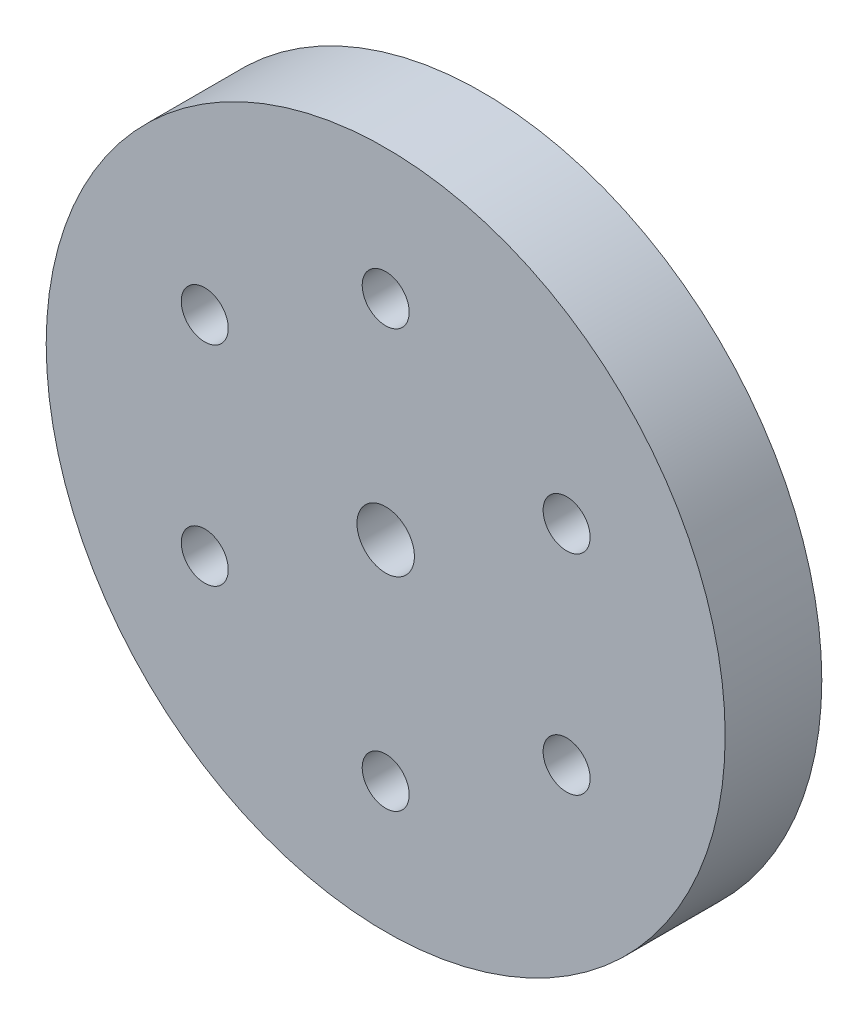
ISO-10303-21;
HEADER;
FILE_DESCRIPTION(('STEP AP214'),'2;1');
FILE_NAME('part.step','',(''),(''),'','','');
FILE_SCHEMA(('AUTOMOTIVE_DESIGN { 1 0 10303 214 1 1 1 1 }'));
ENDSEC;
DATA;
#1=APPLICATION_CONTEXT('core data for automotive mechanical design processes');
#2=APPLICATION_PROTOCOL_DEFINITION('international standard','automotive_design',2000,#1);
#3=PRODUCT_CONTEXT('',#1,'mechanical');
#4=PRODUCT('Part','Part','',(#3));
#5=PRODUCT_RELATED_PRODUCT_CATEGORY('part','',(#4));
#6=PRODUCT_DEFINITION_FORMATION('','',#4);
#7=PRODUCT_DEFINITION_CONTEXT('part definition',#1,'design');
#8=PRODUCT_DEFINITION('design','',#6,#7);
#9=PRODUCT_DEFINITION_SHAPE('','',#8);
#10=(LENGTH_UNIT() NAMED_UNIT(*) SI_UNIT(.MILLI.,.METRE.));
#11=(NAMED_UNIT(*) PLANE_ANGLE_UNIT() SI_UNIT($,.RADIAN.));
#12=(NAMED_UNIT(*) SI_UNIT($,.STERADIAN.) SOLID_ANGLE_UNIT());
#13=UNCERTAINTY_MEASURE_WITH_UNIT(LENGTH_MEASURE(1.E-05),#10,'distance_accuracy_value','');
#14=(GEOMETRIC_REPRESENTATION_CONTEXT(3) GLOBAL_UNCERTAINTY_ASSIGNED_CONTEXT((#13)) GLOBAL_UNIT_ASSIGNED_CONTEXT((#10,
#11,#12)) REPRESENTATION_CONTEXT('',''));
#15=CARTESIAN_POINT('',(0.,0.,0.));
#16=DIRECTION('',(0.,0.,1.));
#17=DIRECTION('',(1.,0.,0.));
#18=AXIS2_PLACEMENT_3D('',#15,#16,#17);
#19=CARTESIAN_POINT('',(-6.92820323027552,3.99999999999998,3.7));
#20=DIRECTION('',(0.,0.,-1.));
#21=DIRECTION('',(-1.,0.,0.));
#22=AXIS2_PLACEMENT_3D('',#19,#20,#21);
#23=CYLINDRICAL_SURFACE('',#22,0.9);
#24=CARTESIAN_POINT('',(-6.92820323027552,3.99999999999998,3.7));
#25=DIRECTION('',(0.,0.,-1.));
#26=DIRECTION('',(-0.499999999999998,-0.86602540378444,0.));
#27=AXIS2_PLACEMENT_3D('',#24,#25,#26);
#28=CIRCLE('',#27,0.9);
#29=CARTESIAN_POINT('',(-7.37820323027552,3.22057713659399,3.7));
#30=VERTEX_POINT('',#29);
#31=EDGE_CURVE('E86',#30,#30,#28,.T.);
#32=ORIENTED_EDGE('',*,*,#31,.F.);
#33=EDGE_LOOP('',(#32));
#34=FACE_BOUND('',#33,.T.);
#35=CARTESIAN_POINT('',(-6.92820323027552,3.99999999999998,1.5));
#36=DIRECTION('',(0.,0.,-1.));
#37=DIRECTION('',(-1.,0.,0.));
#38=AXIS2_PLACEMENT_3D('',#35,#36,#37);
#39=CIRCLE('',#38,0.9);
#40=CARTESIAN_POINT('',(-7.82820323027552,3.99999999999998,1.5));
#41=VERTEX_POINT('',#40);
#42=EDGE_CURVE('E41',#41,#41,#39,.F.);
#43=ORIENTED_EDGE('',*,*,#42,.F.);
#44=EDGE_LOOP('',(#43));
#45=FACE_BOUND('',#44,.T.);
#46=ADVANCED_FACE('F37',(#34,#45),#23,.F.);
#47=CARTESIAN_POINT('',(-6.92820323027549,-4.00000000000003,3.7));
#48=DIRECTION('',(0.,0.,-1.));
#49=DIRECTION('',(-1.,0.,0.));
#50=AXIS2_PLACEMENT_3D('',#47,#48,#49);
#51=CYLINDRICAL_SURFACE('',#50,0.9);
#52=CARTESIAN_POINT('',(-6.92820323027549,-4.00000000000003,3.7));
#53=DIRECTION('',(0.,0.,-1.));
#54=DIRECTION('',(0.500000000000004,-0.866025403784436,0.));
#55=AXIS2_PLACEMENT_3D('',#52,#53,#54);
#56=CIRCLE('',#55,0.9);
#57=CARTESIAN_POINT('',(-6.47820323027549,-4.77942286340603,3.7));
#58=VERTEX_POINT('',#57);
#59=EDGE_CURVE('E90',#58,#58,#56,.T.);
#60=ORIENTED_EDGE('',*,*,#59,.F.);
#61=EDGE_LOOP('',(#60));
#62=FACE_BOUND('',#61,.T.);
#63=CARTESIAN_POINT('',(-6.92820323027549,-4.00000000000003,1.5));
#64=DIRECTION('',(0.,0.,-1.));
#65=DIRECTION('',(-1.,0.,0.));
#66=AXIS2_PLACEMENT_3D('',#63,#64,#65);
#67=CIRCLE('',#66,0.9);
#68=CARTESIAN_POINT('',(-7.82820323027549,-4.00000000000003,1.5));
#69=VERTEX_POINT('',#68);
#70=EDGE_CURVE('E68',#69,#69,#67,.F.);
#71=ORIENTED_EDGE('',*,*,#70,.F.);
#72=EDGE_LOOP('',(#71));
#73=FACE_BOUND('',#72,.T.);
#74=ADVANCED_FACE('F119',(#62,#73),#51,.F.);
#75=CARTESIAN_POINT('',(0.,-8.,3.7));
#76=DIRECTION('',(0.,0.,-1.));
#77=DIRECTION('',(-1.,0.,0.));
#78=AXIS2_PLACEMENT_3D('',#75,#76,#77);
#79=CYLINDRICAL_SURFACE('',#78,0.9);
#80=CARTESIAN_POINT('',(0.,-8.,3.7));
#81=DIRECTION('',(0.,0.,-1.));
#82=DIRECTION('',(1.,0.,0.));
#83=AXIS2_PLACEMENT_3D('',#80,#81,#82);
#84=CIRCLE('',#83,0.9);
#85=CARTESIAN_POINT('',(0.9,-8.,3.7));
#86=VERTEX_POINT('',#85);
#87=EDGE_CURVE('E82',#86,#86,#84,.T.);
#88=ORIENTED_EDGE('',*,*,#87,.F.);
#89=EDGE_LOOP('',(#88));
#90=FACE_BOUND('',#89,.T.);
#91=CARTESIAN_POINT('',(0.,-8.,1.5));
#92=DIRECTION('',(0.,0.,-1.));
#93=DIRECTION('',(-1.,0.,0.));
#94=AXIS2_PLACEMENT_3D('',#91,#92,#93);
#95=CIRCLE('',#94,0.9);
#96=CARTESIAN_POINT('',(-0.9,-8.,1.5));
#97=VERTEX_POINT('',#96);
#98=EDGE_CURVE('E66',#97,#97,#95,.F.);
#99=ORIENTED_EDGE('',*,*,#98,.F.);
#100=EDGE_LOOP('',(#99));
#101=FACE_BOUND('',#100,.T.);
#102=ADVANCED_FACE('F125',(#90,#101),#79,.F.);
#103=CARTESIAN_POINT('',(6.92820323027555,-3.99999999999994,3.7));
#104=DIRECTION('',(0.,0.,-1.));
#105=DIRECTION('',(-1.,0.,0.));
#106=AXIS2_PLACEMENT_3D('',#103,#104,#105);
#107=CYLINDRICAL_SURFACE('',#106,0.9);
#108=CARTESIAN_POINT('',(6.92820323027555,-3.99999999999994,3.7));
#109=DIRECTION('',(0.,0.,-1.));
#110=DIRECTION('',(0.499999999999992,0.866025403784443,0.));
#111=AXIS2_PLACEMENT_3D('',#108,#109,#110);
#112=CIRCLE('',#111,0.9);
#113=CARTESIAN_POINT('',(7.37820323027554,-3.22057713659394,3.7));
#114=VERTEX_POINT('',#113);
#115=EDGE_CURVE('E77',#114,#114,#112,.T.);
#116=ORIENTED_EDGE('',*,*,#115,.F.);
#117=EDGE_LOOP('',(#116));
#118=FACE_BOUND('',#117,.T.);
#119=CARTESIAN_POINT('',(6.92820323027555,-3.99999999999994,1.5));
#120=DIRECTION('',(0.,0.,-1.));
#121=DIRECTION('',(-1.,0.,0.));
#122=AXIS2_PLACEMENT_3D('',#119,#120,#121);
#123=CIRCLE('',#122,0.9);
#124=CARTESIAN_POINT('',(6.02820323027555,-3.99999999999994,1.5));
#125=VERTEX_POINT('',#124);
#126=EDGE_CURVE('E62',#125,#125,#123,.F.);
#127=ORIENTED_EDGE('',*,*,#126,.F.);
#128=EDGE_LOOP('',(#127));
#129=FACE_BOUND('',#128,.T.);
#130=ADVANCED_FACE('F172',(#118,#129),#107,.F.);
#131=CARTESIAN_POINT('',(6.92820323027546,4.00000000000008,3.7));
#132=DIRECTION('',(0.,0.,-1.));
#133=DIRECTION('',(-1.,0.,0.));
#134=AXIS2_PLACEMENT_3D('',#131,#132,#133);
#135=CYLINDRICAL_SURFACE('',#134,0.9);
#136=CARTESIAN_POINT('',(6.92820323027546,4.00000000000008,3.7));
#137=DIRECTION('',(0.,0.,-1.));
#138=DIRECTION('',(-0.50000000000001,0.866025403784433,0.));
#139=AXIS2_PLACEMENT_3D('',#136,#137,#138);
#140=CIRCLE('',#139,0.9);
#141=CARTESIAN_POINT('',(6.47820323027545,4.77942286340607,3.7));
#142=VERTEX_POINT('',#141);
#143=EDGE_CURVE('E73',#142,#142,#140,.T.);
#144=ORIENTED_EDGE('',*,*,#143,.F.);
#145=EDGE_LOOP('',(#144));
#146=FACE_BOUND('',#145,.T.);
#147=CARTESIAN_POINT('',(6.92820323027546,4.00000000000008,1.5));
#148=DIRECTION('',(0.,0.,-1.));
#149=DIRECTION('',(-1.,0.,0.));
#150=AXIS2_PLACEMENT_3D('',#147,#148,#149);
#151=CIRCLE('',#150,0.9);
#152=CARTESIAN_POINT('',(6.02820323027546,4.00000000000008,1.5));
#153=VERTEX_POINT('',#152);
#154=EDGE_CURVE('E59',#153,#153,#151,.F.);
#155=ORIENTED_EDGE('',*,*,#154,.F.);
#156=EDGE_LOOP('',(#155));
#157=FACE_BOUND('',#156,.T.);
#158=ADVANCED_FACE('F115',(#146,#157),#135,.F.);
#159=CARTESIAN_POINT('',(0.,8.,3.7));
#160=DIRECTION('',(0.,0.,-1.));
#161=DIRECTION('',(-1.,0.,0.));
#162=AXIS2_PLACEMENT_3D('',#159,#160,#161);
#163=CYLINDRICAL_SURFACE('',#162,0.9);
#164=CARTESIAN_POINT('',(0.,8.,3.7));
#165=DIRECTION('',(0.,0.,-1.));
#166=DIRECTION('',(-1.,0.,0.));
#167=AXIS2_PLACEMENT_3D('',#164,#165,#166);
#168=CIRCLE('',#167,0.9);
#169=CARTESIAN_POINT('',(-0.9,8.,3.7));
#170=VERTEX_POINT('',#169);
#171=EDGE_CURVE('E50',#170,#170,#168,.T.);
#172=ORIENTED_EDGE('',*,*,#171,.F.);
#173=EDGE_LOOP('',(#172));
#174=FACE_BOUND('',#173,.T.);
#175=CARTESIAN_POINT('',(0.,8.,1.5));
#176=DIRECTION('',(0.,0.,-1.));
#177=DIRECTION('',(-1.,0.,0.));
#178=AXIS2_PLACEMENT_3D('',#175,#176,#177);
#179=CIRCLE('',#178,0.9);
#180=CARTESIAN_POINT('',(-0.9,8.,1.5));
#181=VERTEX_POINT('',#180);
#182=EDGE_CURVE('E55',#181,#181,#179,.F.);
#183=ORIENTED_EDGE('',*,*,#182,.F.);
#184=EDGE_LOOP('',(#183));
#185=FACE_BOUND('',#184,.T.);
#186=ADVANCED_FACE('F106',(#174,#185),#163,.F.);
#187=CARTESIAN_POINT('',(0.,0.,3.7));
#188=DIRECTION('',(0.,0.,-1.));
#189=DIRECTION('',(-1.,0.,0.));
#190=AXIS2_PLACEMENT_3D('',#187,#188,#189);
#191=CYLINDRICAL_SURFACE('',#190,13.);
#192=CARTESIAN_POINT('',(0.,0.,3.7));
#193=DIRECTION('',(0.,0.,1.));
#194=DIRECTION('',(1.,0.,0.));
#195=AXIS2_PLACEMENT_3D('',#192,#193,#194);
#196=CIRCLE('',#195,13.);
#197=CARTESIAN_POINT('',(13.,0.,3.7));
#198=VERTEX_POINT('',#197);
#199=EDGE_CURVE('E10',#198,#198,#196,.T.);
#200=ORIENTED_EDGE('',*,*,#199,.F.);
#201=EDGE_LOOP('',(#200));
#202=FACE_BOUND('',#201,.T.);
#203=CARTESIAN_POINT('',(0.,0.,0.));
#204=DIRECTION('',(0.,0.,1.));
#205=DIRECTION('',(1.,0.,0.));
#206=AXIS2_PLACEMENT_3D('',#203,#204,#205);
#207=CIRCLE('',#206,13.);
#208=CARTESIAN_POINT('',(13.,0.,0.));
#209=VERTEX_POINT('',#208);
#210=EDGE_CURVE('E45',#209,#209,#207,.T.);
#211=ORIENTED_EDGE('',*,*,#210,.T.);
#212=EDGE_LOOP('',(#211));
#213=FACE_BOUND('',#212,.T.);
#214=ADVANCED_FACE('F39',(#202,#213),#191,.T.);
#215=CARTESIAN_POINT('',(0.,0.,3.7));
#216=DIRECTION('',(0.,0.,1.));
#217=DIRECTION('',(1.,0.,0.));
#218=AXIS2_PLACEMENT_3D('',#215,#216,#217);
#219=PLANE('',#218);
#220=CARTESIAN_POINT('',(0.,0.,3.7));
#221=DIRECTION('',(0.,0.,-1.));
#222=DIRECTION('',(-1.,0.,0.));
#223=AXIS2_PLACEMENT_3D('',#220,#221,#222);
#224=CIRCLE('',#223,1.1);
#225=CARTESIAN_POINT('',(-1.1,0.,3.7));
#226=VERTEX_POINT('',#225);
#227=EDGE_CURVE('E214',#226,#226,#224,.T.);
#228=ORIENTED_EDGE('',*,*,#227,.T.);
#229=EDGE_LOOP('',(#228));
#230=FACE_BOUND('',#229,.T.);
#231=ORIENTED_EDGE('',*,*,#143,.T.);
#232=EDGE_LOOP('',(#231));
#233=FACE_BOUND('',#232,.T.);
#234=ORIENTED_EDGE('',*,*,#115,.T.);
#235=EDGE_LOOP('',(#234));
#236=FACE_BOUND('',#235,.T.);
#237=ORIENTED_EDGE('',*,*,#87,.T.);
#238=EDGE_LOOP('',(#237));
#239=FACE_BOUND('',#238,.T.);
#240=ORIENTED_EDGE('',*,*,#59,.T.);
#241=EDGE_LOOP('',(#240));
#242=FACE_BOUND('',#241,.T.);
#243=ORIENTED_EDGE('',*,*,#31,.T.);
#244=EDGE_LOOP('',(#243));
#245=FACE_BOUND('',#244,.T.);
#246=ORIENTED_EDGE('',*,*,#171,.T.);
#247=EDGE_LOOP('',(#246));
#248=FACE_BOUND('',#247,.T.);
#249=ORIENTED_EDGE('',*,*,#199,.T.);
#250=EDGE_LOOP('',(#249));
#251=FACE_BOUND('',#250,.T.);
#252=ADVANCED_FACE('F101',(#230,#233,#236,#239,#242,#245,#248,#251),#219,.T.);
#253=CARTESIAN_POINT('',(0.,0.,0.));
#254=DIRECTION('',(0.,0.,1.));
#255=DIRECTION('',(1.,0.,0.));
#256=AXIS2_PLACEMENT_3D('',#253,#254,#255);
#257=PLANE('',#256);
#258=CARTESIAN_POINT('',(0.,0.,0.));
#259=DIRECTION('',(0.,0.,-1.));
#260=DIRECTION('',(-1.,0.,0.));
#261=AXIS2_PLACEMENT_3D('',#258,#259,#260);
#262=CIRCLE('',#261,1.1);
#263=CARTESIAN_POINT('',(-1.1,0.,0.));
#264=VERTEX_POINT('',#263);
#265=EDGE_CURVE('E217',#264,#264,#262,.T.);
#266=ORIENTED_EDGE('',*,*,#265,.F.);
#267=EDGE_LOOP('',(#266));
#268=FACE_BOUND('',#267,.T.);
#269=CARTESIAN_POINT('',(6.92820323027546,4.00000000000008,0.));
#270=DIRECTION('',(0.,0.,-1.));
#271=DIRECTION('',(-0.50000000000001,0.866025403784433,0.));
#272=AXIS2_PLACEMENT_3D('',#269,#270,#271);
#273=CIRCLE('',#272,1.5);
#274=CARTESIAN_POINT('',(6.17820323027545,5.29903810567673,0.));
#275=VERTEX_POINT('',#274);
#276=EDGE_CURVE('E219',#275,#275,#273,.T.);
#277=ORIENTED_EDGE('',*,*,#276,.F.);
#278=EDGE_LOOP('',(#277));
#279=FACE_BOUND('',#278,.T.);
#280=CARTESIAN_POINT('',(6.92820323027555,-3.99999999999994,0.));
#281=DIRECTION('',(0.,0.,-1.));
#282=DIRECTION('',(0.499999999999992,0.866025403784443,0.));
#283=AXIS2_PLACEMENT_3D('',#280,#281,#282);
#284=CIRCLE('',#283,1.5);
#285=CARTESIAN_POINT('',(7.67820323027553,-2.70096189432327,0.));
#286=VERTEX_POINT('',#285);
#287=EDGE_CURVE('E237',#286,#286,#284,.T.);
#288=ORIENTED_EDGE('',*,*,#287,.F.);
#289=EDGE_LOOP('',(#288));
#290=FACE_BOUND('',#289,.T.);
#291=CARTESIAN_POINT('',(0.,-8.,0.));
#292=DIRECTION('',(0.,0.,-1.));
#293=DIRECTION('',(1.,0.,0.));
#294=AXIS2_PLACEMENT_3D('',#291,#292,#293);
#295=CIRCLE('',#294,1.5);
#296=CARTESIAN_POINT('',(1.5,-8.,0.));
#297=VERTEX_POINT('',#296);
#298=EDGE_CURVE('E232',#297,#297,#295,.T.);
#299=ORIENTED_EDGE('',*,*,#298,.F.);
#300=EDGE_LOOP('',(#299));
#301=FACE_BOUND('',#300,.T.);
#302=CARTESIAN_POINT('',(-6.92820323027549,-4.00000000000003,0.));
#303=DIRECTION('',(0.,0.,-1.));
#304=DIRECTION('',(0.500000000000004,-0.866025403784436,0.));
#305=AXIS2_PLACEMENT_3D('',#302,#303,#304);
#306=CIRCLE('',#305,1.5);
#307=CARTESIAN_POINT('',(-6.17820323027549,-5.29903810567669,0.));
#308=VERTEX_POINT('',#307);
#309=EDGE_CURVE('E226',#308,#308,#306,.T.);
#310=ORIENTED_EDGE('',*,*,#309,.F.);
#311=EDGE_LOOP('',(#310));
#312=FACE_BOUND('',#311,.T.);
#313=CARTESIAN_POINT('',(-6.92820323027552,3.99999999999998,0.));
#314=DIRECTION('',(0.,0.,-1.));
#315=DIRECTION('',(-0.499999999999998,-0.86602540378444,0.));
#316=AXIS2_PLACEMENT_3D('',#313,#314,#315);
#317=CIRCLE('',#316,1.5);
#318=CARTESIAN_POINT('',(-7.67820323027552,2.70096189432332,0.));
#319=VERTEX_POINT('',#318);
#320=EDGE_CURVE('E225',#319,#319,#317,.T.);
#321=ORIENTED_EDGE('',*,*,#320,.F.);
#322=EDGE_LOOP('',(#321));
#323=FACE_BOUND('',#322,.T.);
#324=CARTESIAN_POINT('',(0.,8.,0.));
#325=DIRECTION('',(0.,0.,-1.));
#326=DIRECTION('',(-1.,0.,0.));
#327=AXIS2_PLACEMENT_3D('',#324,#325,#326);
#328=CIRCLE('',#327,1.5);
#329=CARTESIAN_POINT('',(-1.5,8.,0.));
#330=VERTEX_POINT('',#329);
#331=EDGE_CURVE('E89',#330,#330,#328,.T.);
#332=ORIENTED_EDGE('',*,*,#331,.F.);
#333=EDGE_LOOP('',(#332));
#334=FACE_BOUND('',#333,.T.);
#335=ORIENTED_EDGE('',*,*,#210,.F.);
#336=EDGE_LOOP('',(#335));
#337=FACE_BOUND('',#336,.T.);
#338=ADVANCED_FACE('F97',(#268,#279,#290,#301,#312,#323,#334,#337),#257,.F.);
#339=CARTESIAN_POINT('',(0.,8.,1.5));
#340=DIRECTION('',(0.,0.,-1.));
#341=DIRECTION('',(-1.,0.,0.));
#342=AXIS2_PLACEMENT_3D('',#339,#340,#341);
#343=PLANE('',#342);
#344=CARTESIAN_POINT('',(0.,8.,1.5));
#345=DIRECTION('',(0.,0.,-1.));
#346=DIRECTION('',(-1.,0.,0.));
#347=AXIS2_PLACEMENT_3D('',#344,#345,#346);
#348=CIRCLE('',#347,1.5);
#349=CARTESIAN_POINT('',(-1.5,8.,1.5));
#350=VERTEX_POINT('',#349);
#351=EDGE_CURVE('E58',#350,#350,#348,.T.);
#352=ORIENTED_EDGE('',*,*,#351,.T.);
#353=EDGE_LOOP('',(#352));
#354=FACE_BOUND('',#353,.T.);
#355=ORIENTED_EDGE('',*,*,#182,.T.);
#356=EDGE_LOOP('',(#355));
#357=FACE_BOUND('',#356,.T.);
#358=ADVANCED_FACE('F100',(#354,#357),#343,.T.);
#359=CARTESIAN_POINT('',(0.,8.,1.5));
#360=DIRECTION('',(0.,0.,-1.));
#361=DIRECTION('',(-1.,0.,0.));
#362=AXIS2_PLACEMENT_3D('',#359,#360,#361);
#363=CYLINDRICAL_SURFACE('',#362,1.5);
#364=ORIENTED_EDGE('',*,*,#351,.F.);
#365=EDGE_LOOP('',(#364));
#366=FACE_BOUND('',#365,.T.);
#367=ORIENTED_EDGE('',*,*,#331,.T.);
#368=EDGE_LOOP('',(#367));
#369=FACE_BOUND('',#368,.T.);
#370=ADVANCED_FACE('F95',(#366,#369),#363,.F.);
#371=CARTESIAN_POINT('',(6.92820323027546,4.00000000000008,1.5));
#372=DIRECTION('',(0.,0.,-1.));
#373=DIRECTION('',(-0.50000000000001,0.866025403784433,0.));
#374=AXIS2_PLACEMENT_3D('',#371,#372,#373);
#375=PLANE('',#374);
#376=CARTESIAN_POINT('',(6.92820323027546,4.00000000000008,1.5));
#377=DIRECTION('',(0.,0.,-1.));
#378=DIRECTION('',(-0.50000000000001,0.866025403784433,0.));
#379=AXIS2_PLACEMENT_3D('',#376,#377,#378);
#380=CIRCLE('',#379,1.5);
#381=CARTESIAN_POINT('',(6.17820323027545,5.29903810567673,1.5));
#382=VERTEX_POINT('',#381);
#383=EDGE_CURVE('E240',#382,#382,#380,.T.);
#384=ORIENTED_EDGE('',*,*,#383,.T.);
#385=EDGE_LOOP('',(#384));
#386=FACE_BOUND('',#385,.T.);
#387=ORIENTED_EDGE('',*,*,#154,.T.);
#388=EDGE_LOOP('',(#387));
#389=FACE_BOUND('',#388,.T.);
#390=ADVANCED_FACE('F137',(#386,#389),#375,.T.);
#391=CARTESIAN_POINT('',(6.92820323027546,4.00000000000008,1.5));
#392=DIRECTION('',(0.,0.,-1.));
#393=DIRECTION('',(-1.,0.,0.));
#394=AXIS2_PLACEMENT_3D('',#391,#392,#393);
#395=CYLINDRICAL_SURFACE('',#394,1.5);
#396=ORIENTED_EDGE('',*,*,#383,.F.);
#397=EDGE_LOOP('',(#396));
#398=FACE_BOUND('',#397,.T.);
#399=ORIENTED_EDGE('',*,*,#276,.T.);
#400=EDGE_LOOP('',(#399));
#401=FACE_BOUND('',#400,.T.);
#402=ADVANCED_FACE('F142',(#398,#401),#395,.F.);
#403=CARTESIAN_POINT('',(6.92820323027555,-3.99999999999994,1.5));
#404=DIRECTION('',(0.,0.,-1.));
#405=DIRECTION('',(0.499999999999992,0.866025403784443,0.));
#406=AXIS2_PLACEMENT_3D('',#403,#404,#405);
#407=PLANE('',#406);
#408=CARTESIAN_POINT('',(6.92820323027555,-3.99999999999994,1.5));
#409=DIRECTION('',(0.,0.,-1.));
#410=DIRECTION('',(0.499999999999992,0.866025403784443,0.));
#411=AXIS2_PLACEMENT_3D('',#408,#409,#410);
#412=CIRCLE('',#411,1.5);
#413=CARTESIAN_POINT('',(7.67820323027553,-2.70096189432327,1.5));
#414=VERTEX_POINT('',#413);
#415=EDGE_CURVE('E235',#414,#414,#412,.T.);
#416=ORIENTED_EDGE('',*,*,#415,.T.);
#417=EDGE_LOOP('',(#416));
#418=FACE_BOUND('',#417,.T.);
#419=ORIENTED_EDGE('',*,*,#126,.T.);
#420=EDGE_LOOP('',(#419));
#421=FACE_BOUND('',#420,.T.);
#422=ADVANCED_FACE('F152',(#418,#421),#407,.T.);
#423=CARTESIAN_POINT('',(6.92820323027555,-3.99999999999994,1.5));
#424=DIRECTION('',(0.,0.,-1.));
#425=DIRECTION('',(-1.,0.,0.));
#426=AXIS2_PLACEMENT_3D('',#423,#424,#425);
#427=CYLINDRICAL_SURFACE('',#426,1.5);
#428=ORIENTED_EDGE('',*,*,#415,.F.);
#429=EDGE_LOOP('',(#428));
#430=FACE_BOUND('',#429,.T.);
#431=ORIENTED_EDGE('',*,*,#287,.T.);
#432=EDGE_LOOP('',(#431));
#433=FACE_BOUND('',#432,.T.);
#434=ADVANCED_FACE('F158',(#430,#433),#427,.F.);
#435=CARTESIAN_POINT('',(0.,-8.,1.5));
#436=DIRECTION('',(0.,0.,-1.));
#437=DIRECTION('',(1.,0.,0.));
#438=AXIS2_PLACEMENT_3D('',#435,#436,#437);
#439=PLANE('',#438);
#440=CARTESIAN_POINT('',(0.,-8.,1.5));
#441=DIRECTION('',(0.,0.,-1.));
#442=DIRECTION('',(1.,0.,0.));
#443=AXIS2_PLACEMENT_3D('',#440,#441,#442);
#444=CIRCLE('',#443,1.5);
#445=CARTESIAN_POINT('',(1.5,-8.,1.5));
#446=VERTEX_POINT('',#445);
#447=EDGE_CURVE('E229',#446,#446,#444,.T.);
#448=ORIENTED_EDGE('',*,*,#447,.T.);
#449=EDGE_LOOP('',(#448));
#450=FACE_BOUND('',#449,.T.);
#451=ORIENTED_EDGE('',*,*,#98,.T.);
#452=EDGE_LOOP('',(#451));
#453=FACE_BOUND('',#452,.T.);
#454=ADVANCED_FACE('F189',(#450,#453),#439,.T.);
#455=CARTESIAN_POINT('',(0.,-8.,1.5));
#456=DIRECTION('',(0.,0.,-1.));
#457=DIRECTION('',(-1.,0.,0.));
#458=AXIS2_PLACEMENT_3D('',#455,#456,#457);
#459=CYLINDRICAL_SURFACE('',#458,1.5);
#460=ORIENTED_EDGE('',*,*,#447,.F.);
#461=EDGE_LOOP('',(#460));
#462=FACE_BOUND('',#461,.T.);
#463=ORIENTED_EDGE('',*,*,#298,.T.);
#464=EDGE_LOOP('',(#463));
#465=FACE_BOUND('',#464,.T.);
#466=ADVANCED_FACE('F193',(#462,#465),#459,.F.);
#467=CARTESIAN_POINT('',(-6.92820323027549,-4.00000000000003,1.5));
#468=DIRECTION('',(0.,0.,-1.));
#469=DIRECTION('',(0.500000000000004,-0.866025403784436,0.));
#470=AXIS2_PLACEMENT_3D('',#467,#468,#469);
#471=PLANE('',#470);
#472=CARTESIAN_POINT('',(-6.92820323027549,-4.00000000000003,1.5));
#473=DIRECTION('',(0.,0.,-1.));
#474=DIRECTION('',(0.500000000000004,-0.866025403784436,0.));
#475=AXIS2_PLACEMENT_3D('',#472,#473,#474);
#476=CIRCLE('',#475,1.5);
#477=CARTESIAN_POINT('',(-6.17820323027549,-5.29903810567669,1.5));
#478=VERTEX_POINT('',#477);
#479=EDGE_CURVE('E222',#478,#478,#476,.T.);
#480=ORIENTED_EDGE('',*,*,#479,.T.);
#481=EDGE_LOOP('',(#480));
#482=FACE_BOUND('',#481,.T.);
#483=ORIENTED_EDGE('',*,*,#70,.T.);
#484=EDGE_LOOP('',(#483));
#485=FACE_BOUND('',#484,.T.);
#486=ADVANCED_FACE('F196',(#482,#485),#471,.T.);
#487=CARTESIAN_POINT('',(-6.92820323027549,-4.00000000000003,1.5));
#488=DIRECTION('',(0.,0.,-1.));
#489=DIRECTION('',(-1.,0.,0.));
#490=AXIS2_PLACEMENT_3D('',#487,#488,#489);
#491=CYLINDRICAL_SURFACE('',#490,1.5);
#492=ORIENTED_EDGE('',*,*,#479,.F.);
#493=EDGE_LOOP('',(#492));
#494=FACE_BOUND('',#493,.T.);
#495=ORIENTED_EDGE('',*,*,#309,.T.);
#496=EDGE_LOOP('',(#495));
#497=FACE_BOUND('',#496,.T.);
#498=ADVANCED_FACE('F165',(#494,#497),#491,.F.);
#499=CARTESIAN_POINT('',(-6.92820323027552,3.99999999999998,1.5));
#500=DIRECTION('',(0.,0.,-1.));
#501=DIRECTION('',(-0.499999999999998,-0.86602540378444,0.));
#502=AXIS2_PLACEMENT_3D('',#499,#500,#501);
#503=PLANE('',#502);
#504=CARTESIAN_POINT('',(-6.92820323027552,3.99999999999998,1.5));
#505=DIRECTION('',(0.,0.,-1.));
#506=DIRECTION('',(-0.499999999999998,-0.86602540378444,0.));
#507=AXIS2_PLACEMENT_3D('',#504,#505,#506);
#508=CIRCLE('',#507,1.5);
#509=CARTESIAN_POINT('',(-7.67820323027552,2.70096189432332,1.5));
#510=VERTEX_POINT('',#509);
#511=EDGE_CURVE('E63',#510,#510,#508,.T.);
#512=ORIENTED_EDGE('',*,*,#511,.T.);
#513=EDGE_LOOP('',(#512));
#514=FACE_BOUND('',#513,.T.);
#515=ORIENTED_EDGE('',*,*,#42,.T.);
#516=EDGE_LOOP('',(#515));
#517=FACE_BOUND('',#516,.T.);
#518=ADVANCED_FACE('F161',(#514,#517),#503,.T.);
#519=CARTESIAN_POINT('',(-6.92820323027552,3.99999999999998,1.5));
#520=DIRECTION('',(0.,0.,-1.));
#521=DIRECTION('',(-1.,0.,0.));
#522=AXIS2_PLACEMENT_3D('',#519,#520,#521);
#523=CYLINDRICAL_SURFACE('',#522,1.5);
#524=ORIENTED_EDGE('',*,*,#511,.F.);
#525=EDGE_LOOP('',(#524));
#526=FACE_BOUND('',#525,.T.);
#527=ORIENTED_EDGE('',*,*,#320,.T.);
#528=EDGE_LOOP('',(#527));
#529=FACE_BOUND('',#528,.T.);
#530=ADVANCED_FACE('F164',(#526,#529),#523,.F.);
#531=CARTESIAN_POINT('',(0.,0.,3.7));
#532=DIRECTION('',(0.,0.,-1.));
#533=DIRECTION('',(-1.,0.,0.));
#534=AXIS2_PLACEMENT_3D('',#531,#532,#533);
#535=CYLINDRICAL_SURFACE('',#534,1.1);
#536=ORIENTED_EDGE('',*,*,#227,.F.);
#537=EDGE_LOOP('',(#536));
#538=FACE_BOUND('',#537,.T.);
#539=ORIENTED_EDGE('',*,*,#265,.T.);
#540=EDGE_LOOP('',(#539));
#541=FACE_BOUND('',#540,.T.);
#542=ADVANCED_FACE('F168',(#538,#541),#535,.F.);
#543=CLOSED_SHELL('',(#46,#74,#102,#130,#158,#186,#214,#252,#338,#358,#370,#390,#402,#422,#434,
#454,#466,#486,#498,#518,#530,#542));
#544=MANIFOLD_SOLID_BREP('B2',#543);
#545=ADVANCED_BREP_SHAPE_REPRESENTATION('',(#18,#544),#14);
#546=SHAPE_DEFINITION_REPRESENTATION(#9,#545);
ENDSEC;
END-ISO-10303-21;
